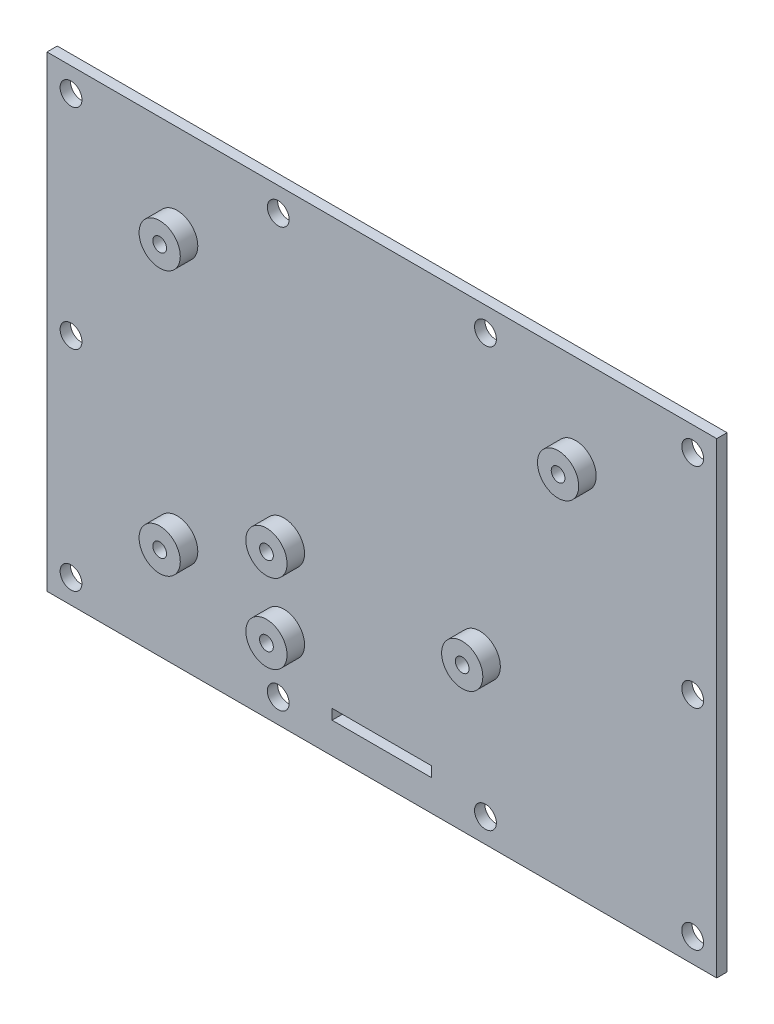
ISO-10303-21;
HEADER;
FILE_DESCRIPTION(('STEP AP214'),'2;1');
FILE_NAME('part.step','',(''),(''),'','','');
FILE_SCHEMA(('AUTOMOTIVE_DESIGN { 1 0 10303 214 1 1 1 1 }'));
ENDSEC;
DATA;
#1=APPLICATION_CONTEXT('core data for automotive mechanical design processes');
#2=APPLICATION_PROTOCOL_DEFINITION('international standard','automotive_design',2000,#1);
#3=PRODUCT_CONTEXT('',#1,'mechanical');
#4=PRODUCT('Part','Part','',(#3));
#5=PRODUCT_RELATED_PRODUCT_CATEGORY('part','',(#4));
#6=PRODUCT_DEFINITION_FORMATION('','',#4);
#7=PRODUCT_DEFINITION_CONTEXT('part definition',#1,'design');
#8=PRODUCT_DEFINITION('design','',#6,#7);
#9=PRODUCT_DEFINITION_SHAPE('','',#8);
#10=(LENGTH_UNIT() NAMED_UNIT(*) SI_UNIT(.MILLI.,.METRE.));
#11=(NAMED_UNIT(*) PLANE_ANGLE_UNIT() SI_UNIT($,.RADIAN.));
#12=(NAMED_UNIT(*) SI_UNIT($,.STERADIAN.) SOLID_ANGLE_UNIT());
#13=UNCERTAINTY_MEASURE_WITH_UNIT(LENGTH_MEASURE(1.E-05),#10,'distance_accuracy_value','');
#14=(GEOMETRIC_REPRESENTATION_CONTEXT(3) GLOBAL_UNCERTAINTY_ASSIGNED_CONTEXT((#13)) GLOBAL_UNIT_ASSIGNED_CONTEXT((#10,
#11,#12)) REPRESENTATION_CONTEXT('',''));
#15=CARTESIAN_POINT('',(0.,0.,0.));
#16=DIRECTION('',(0.,0.,1.));
#17=DIRECTION('',(1.,0.,0.));
#18=AXIS2_PLACEMENT_3D('',#15,#16,#17);
#19=CARTESIAN_POINT('',(0.,68.,-1.5));
#20=DIRECTION('',(0.,1.,0.));
#21=DIRECTION('',(0.,0.,1.));
#22=AXIS2_PLACEMENT_3D('',#19,#20,#21);
#23=PLANE('',#22);
#24=DIRECTION('',(0.,0.,1.));
#25=VECTOR('',#24,1.);
#26=CARTESIAN_POINT('',(-97.5,68.,-1.5));
#27=LINE('',#26,#25);
#28=CARTESIAN_POINT('',(-97.5,68.,-1.5));
#29=VERTEX_POINT('',#28);
#30=CARTESIAN_POINT('',(-97.5,68.,1.5));
#31=VERTEX_POINT('',#30);
#32=EDGE_CURVE('E201',#29,#31,#27,.T.);
#33=ORIENTED_EDGE('',*,*,#32,.T.);
#34=DIRECTION('',(-1.,0.,0.));
#35=VECTOR('',#34,1.);
#36=CARTESIAN_POINT('',(0.,68.,1.5));
#37=LINE('',#36,#35);
#38=CARTESIAN_POINT('',(97.4999999999999,68.,1.5));
#39=VERTEX_POINT('',#38);
#40=EDGE_CURVE('E154',#39,#31,#37,.T.);
#41=ORIENTED_EDGE('',*,*,#40,.F.);
#42=DIRECTION('',(0.,0.,1.));
#43=VECTOR('',#42,1.);
#44=CARTESIAN_POINT('',(97.4999999999999,68.,-1.5));
#45=LINE('',#44,#43);
#46=CARTESIAN_POINT('',(97.4999999999999,68.,-1.5));
#47=VERTEX_POINT('',#46);
#48=EDGE_CURVE('E61',#47,#39,#45,.T.);
#49=ORIENTED_EDGE('',*,*,#48,.F.);
#50=DIRECTION('',(-1.,0.,0.));
#51=VECTOR('',#50,1.);
#52=CARTESIAN_POINT('',(0.,68.,-1.5));
#53=LINE('',#52,#51);
#54=EDGE_CURVE('E181',#47,#29,#53,.T.);
#55=ORIENTED_EDGE('',*,*,#54,.T.);
#56=EDGE_LOOP('',(#33,#41,#49,#55));
#57=FACE_BOUND('',#56,.T.);
#58=ADVANCED_FACE('F45',(#57),#23,.T.);
#59=CARTESIAN_POINT('',(97.4999999999999,0.,-1.5));
#60=DIRECTION('',(-1.,0.,0.));
#61=DIRECTION('',(0.,0.,1.));
#62=AXIS2_PLACEMENT_3D('',#59,#60,#61);
#63=PLANE('',#62);
#64=ORIENTED_EDGE('',*,*,#48,.T.);
#65=DIRECTION('',(0.,-1.,0.));
#66=VECTOR('',#65,1.);
#67=CARTESIAN_POINT('',(97.4999999999999,0.,1.5));
#68=LINE('',#67,#66);
#69=CARTESIAN_POINT('',(97.4999999999999,-68.,1.5));
#70=VERTEX_POINT('',#69);
#71=EDGE_CURVE('E166',#39,#70,#68,.T.);
#72=ORIENTED_EDGE('',*,*,#71,.T.);
#73=DIRECTION('',(0.,0.,1.));
#74=VECTOR('',#73,1.);
#75=CARTESIAN_POINT('',(97.4999999999999,-68.,-1.5));
#76=LINE('',#75,#74);
#77=CARTESIAN_POINT('',(97.4999999999999,-68.,-1.5));
#78=VERTEX_POINT('',#77);
#79=EDGE_CURVE('E195',#78,#70,#76,.T.);
#80=ORIENTED_EDGE('',*,*,#79,.F.);
#81=DIRECTION('',(0.,-1.,0.));
#82=VECTOR('',#81,1.);
#83=CARTESIAN_POINT('',(97.4999999999999,0.,-1.5));
#84=LINE('',#83,#82);
#85=EDGE_CURVE('E125',#47,#78,#84,.T.);
#86=ORIENTED_EDGE('',*,*,#85,.F.);
#87=EDGE_LOOP('',(#64,#72,#80,#86));
#88=FACE_BOUND('',#87,.T.);
#89=ADVANCED_FACE('F259',(#88),#63,.F.);
#90=CARTESIAN_POINT('',(0.,-68.,-1.5));
#91=DIRECTION('',(0.,1.,0.));
#92=DIRECTION('',(0.,0.,1.));
#93=AXIS2_PLACEMENT_3D('',#90,#91,#92);
#94=PLANE('',#93);
#95=ORIENTED_EDGE('',*,*,#79,.T.);
#96=DIRECTION('',(-1.,0.,0.));
#97=VECTOR('',#96,1.);
#98=CARTESIAN_POINT('',(0.,-68.,1.5));
#99=LINE('',#98,#97);
#100=CARTESIAN_POINT('',(-97.5,-68.,1.5));
#101=VERTEX_POINT('',#100);
#102=EDGE_CURVE('E162',#70,#101,#99,.T.);
#103=ORIENTED_EDGE('',*,*,#102,.T.);
#104=DIRECTION('',(0.,0.,1.));
#105=VECTOR('',#104,1.);
#106=CARTESIAN_POINT('',(-97.5,-68.,-1.5));
#107=LINE('',#106,#105);
#108=CARTESIAN_POINT('',(-97.5,-68.,-1.5));
#109=VERTEX_POINT('',#108);
#110=EDGE_CURVE('E198',#109,#101,#107,.T.);
#111=ORIENTED_EDGE('',*,*,#110,.F.);
#112=DIRECTION('',(-1.,0.,0.));
#113=VECTOR('',#112,1.);
#114=CARTESIAN_POINT('',(0.,-68.,-1.5));
#115=LINE('',#114,#113);
#116=EDGE_CURVE('E69',#78,#109,#115,.T.);
#117=ORIENTED_EDGE('',*,*,#116,.F.);
#118=EDGE_LOOP('',(#95,#103,#111,#117));
#119=FACE_BOUND('',#118,.T.);
#120=ADVANCED_FACE('F264',(#119),#94,.F.);
#121=CARTESIAN_POINT('',(0.,-56.,-1.5));
#122=DIRECTION('',(0.,1.,0.));
#123=DIRECTION('',(-1.,0.,0.));
#124=AXIS2_PLACEMENT_3D('',#121,#122,#123);
#125=PLANE('',#124);
#126=DIRECTION('',(0.,0.,1.));
#127=VECTOR('',#126,1.);
#128=CARTESIAN_POINT('',(14.5,-56.,-1.5));
#129=LINE('',#128,#127);
#130=CARTESIAN_POINT('',(14.5,-56.,-1.5));
#131=VERTEX_POINT('',#130);
#132=CARTESIAN_POINT('',(14.5,-56.,1.5));
#133=VERTEX_POINT('',#132);
#134=EDGE_CURVE('E112',#131,#133,#129,.T.);
#135=ORIENTED_EDGE('',*,*,#134,.T.);
#136=DIRECTION('',(-1.,0.,0.));
#137=VECTOR('',#136,1.);
#138=CARTESIAN_POINT('',(0.,-56.,1.5));
#139=LINE('',#138,#137);
#140=CARTESIAN_POINT('',(-14.5,-56.,1.5));
#141=VERTEX_POINT('',#140);
#142=EDGE_CURVE('E116',#133,#141,#139,.T.);
#143=ORIENTED_EDGE('',*,*,#142,.T.);
#144=DIRECTION('',(0.,0.,1.));
#145=VECTOR('',#144,1.);
#146=CARTESIAN_POINT('',(-14.5,-56.,-1.5));
#147=LINE('',#146,#145);
#148=CARTESIAN_POINT('',(-14.5,-56.,-1.5));
#149=VERTEX_POINT('',#148);
#150=EDGE_CURVE('E204',#149,#141,#147,.T.);
#151=ORIENTED_EDGE('',*,*,#150,.F.);
#152=DIRECTION('',(-1.,0.,0.));
#153=VECTOR('',#152,1.);
#154=CARTESIAN_POINT('',(0.,-56.,-1.5));
#155=LINE('',#154,#153);
#156=EDGE_CURVE('E119',#131,#149,#155,.T.);
#157=ORIENTED_EDGE('',*,*,#156,.F.);
#158=EDGE_LOOP('',(#135,#143,#151,#157));
#159=FACE_BOUND('',#158,.T.);
#160=ADVANCED_FACE('F47',(#159),#125,.F.);
#161=CARTESIAN_POINT('',(-14.5,0.,-1.5));
#162=DIRECTION('',(-1.,0.,0.));
#163=DIRECTION('',(0.,0.,1.));
#164=AXIS2_PLACEMENT_3D('',#161,#162,#163);
#165=PLANE('',#164);
#166=ORIENTED_EDGE('',*,*,#150,.T.);
#167=DIRECTION('',(0.,-1.,0.));
#168=VECTOR('',#167,1.);
#169=CARTESIAN_POINT('',(-14.5,0.,1.5));
#170=LINE('',#169,#168);
#171=CARTESIAN_POINT('',(-14.5,-59.,1.5));
#172=VERTEX_POINT('',#171);
#173=EDGE_CURVE('E140',#141,#172,#170,.T.);
#174=ORIENTED_EDGE('',*,*,#173,.T.);
#175=DIRECTION('',(0.,0.,1.));
#176=VECTOR('',#175,1.);
#177=CARTESIAN_POINT('',(-14.5,-59.,-1.5));
#178=LINE('',#177,#176);
#179=CARTESIAN_POINT('',(-14.5,-59.,-1.5));
#180=VERTEX_POINT('',#179);
#181=EDGE_CURVE('E207',#180,#172,#178,.T.);
#182=ORIENTED_EDGE('',*,*,#181,.F.);
#183=DIRECTION('',(0.,-1.,0.));
#184=VECTOR('',#183,1.);
#185=CARTESIAN_POINT('',(-14.5,0.,-1.5));
#186=LINE('',#185,#184);
#187=EDGE_CURVE('E178',#149,#180,#186,.T.);
#188=ORIENTED_EDGE('',*,*,#187,.F.);
#189=EDGE_LOOP('',(#166,#174,#182,#188));
#190=FACE_BOUND('',#189,.T.);
#191=ADVANCED_FACE('F271',(#190),#165,.F.);
#192=CARTESIAN_POINT('',(0.,-59.,-1.5));
#193=DIRECTION('',(0.,-1.,0.));
#194=DIRECTION('',(0.,0.,-1.));
#195=AXIS2_PLACEMENT_3D('',#192,#193,#194);
#196=PLANE('',#195);
#197=ORIENTED_EDGE('',*,*,#181,.T.);
#198=DIRECTION('',(1.,0.,0.));
#199=VECTOR('',#198,1.);
#200=CARTESIAN_POINT('',(0.,-59.,1.5));
#201=LINE('',#200,#199);
#202=CARTESIAN_POINT('',(14.5,-59.,1.5));
#203=VERTEX_POINT('',#202);
#204=EDGE_CURVE('E135',#172,#203,#201,.T.);
#205=ORIENTED_EDGE('',*,*,#204,.T.);
#206=DIRECTION('',(0.,0.,1.));
#207=VECTOR('',#206,1.);
#208=CARTESIAN_POINT('',(14.5,-59.,-1.5));
#209=LINE('',#208,#207);
#210=CARTESIAN_POINT('',(14.5,-59.,-1.5));
#211=VERTEX_POINT('',#210);
#212=EDGE_CURVE('E124',#211,#203,#209,.T.);
#213=ORIENTED_EDGE('',*,*,#212,.F.);
#214=DIRECTION('',(1.,0.,0.));
#215=VECTOR('',#214,1.);
#216=CARTESIAN_POINT('',(0.,-59.,-1.5));
#217=LINE('',#216,#215);
#218=EDGE_CURVE('E175',#180,#211,#217,.T.);
#219=ORIENTED_EDGE('',*,*,#218,.F.);
#220=EDGE_LOOP('',(#197,#205,#213,#219));
#221=FACE_BOUND('',#220,.T.);
#222=ADVANCED_FACE('F274',(#221),#196,.F.);
#223=CARTESIAN_POINT('',(14.5,0.,-1.5));
#224=DIRECTION('',(-1.,0.,0.));
#225=DIRECTION('',(0.,0.,1.));
#226=AXIS2_PLACEMENT_3D('',#223,#224,#225);
#227=PLANE('',#226);
#228=ORIENTED_EDGE('',*,*,#212,.T.);
#229=DIRECTION('',(0.,-1.,0.));
#230=VECTOR('',#229,1.);
#231=CARTESIAN_POINT('',(14.5,0.,1.5));
#232=LINE('',#231,#230);
#233=EDGE_CURVE('E128',#133,#203,#232,.T.);
#234=ORIENTED_EDGE('',*,*,#233,.F.);
#235=ORIENTED_EDGE('',*,*,#134,.F.);
#236=DIRECTION('',(0.,-1.,0.));
#237=VECTOR('',#236,1.);
#238=CARTESIAN_POINT('',(14.5,0.,-1.5));
#239=LINE('',#238,#237);
#240=EDGE_CURVE('E172',#131,#211,#239,.T.);
#241=ORIENTED_EDGE('',*,*,#240,.T.);
#242=EDGE_LOOP('',(#228,#234,#235,#241));
#243=FACE_BOUND('',#242,.T.);
#244=ADVANCED_FACE('F129',(#243),#227,.T.);
#245=CARTESIAN_POINT('',(-97.5,0.,-1.5));
#246=DIRECTION('',(-1.,0.,0.));
#247=DIRECTION('',(0.,0.,1.));
#248=AXIS2_PLACEMENT_3D('',#245,#246,#247);
#249=PLANE('',#248);
#250=ORIENTED_EDGE('',*,*,#110,.T.);
#251=DIRECTION('',(0.,-1.,0.));
#252=VECTOR('',#251,1.);
#253=CARTESIAN_POINT('',(-97.5,0.,1.5));
#254=LINE('',#253,#252);
#255=EDGE_CURVE('E158',#31,#101,#254,.T.);
#256=ORIENTED_EDGE('',*,*,#255,.F.);
#257=ORIENTED_EDGE('',*,*,#32,.F.);
#258=DIRECTION('',(0.,-1.,0.));
#259=VECTOR('',#258,1.);
#260=CARTESIAN_POINT('',(-97.5,0.,-1.5));
#261=LINE('',#260,#259);
#262=EDGE_CURVE('E184',#29,#109,#261,.T.);
#263=ORIENTED_EDGE('',*,*,#262,.T.);
#264=EDGE_LOOP('',(#250,#256,#257,#263));
#265=FACE_BOUND('',#264,.T.);
#266=ADVANCED_FACE('F269',(#265),#249,.T.);
#267=CARTESIAN_POINT('',(0.,0.,-1.5));
#268=DIRECTION('',(0.,0.,1.));
#269=DIRECTION('',(1.,0.,0.));
#270=AXIS2_PLACEMENT_3D('',#267,#268,#269);
#271=PLANE('',#270);
#272=CARTESIAN_POINT('',(-90.5,-61.,-1.5));
#273=DIRECTION('',(0.,0.,1.));
#274=DIRECTION('',(1.,0.,0.));
#275=AXIS2_PLACEMENT_3D('',#272,#273,#274);
#276=CIRCLE('',#275,3.175);
#277=CARTESIAN_POINT('',(-87.325,-61.,-1.5));
#278=VERTEX_POINT('',#277);
#279=EDGE_CURVE('E815',#278,#278,#276,.T.);
#280=ORIENTED_EDGE('',*,*,#279,.T.);
#281=EDGE_LOOP('',(#280));
#282=FACE_BOUND('',#281,.T.);
#283=CARTESIAN_POINT('',(90.5000000000001,0.,-1.5));
#284=DIRECTION('',(0.,0.,1.));
#285=DIRECTION('',(1.,0.,0.));
#286=AXIS2_PLACEMENT_3D('',#283,#284,#285);
#287=CIRCLE('',#286,3.175);
#288=CARTESIAN_POINT('',(93.6750000000001,0.,-1.5));
#289=VERTEX_POINT('',#288);
#290=EDGE_CURVE('E798',#289,#289,#287,.T.);
#291=ORIENTED_EDGE('',*,*,#290,.T.);
#292=EDGE_LOOP('',(#291));
#293=FACE_BOUND('',#292,.T.);
#294=CARTESIAN_POINT('',(30.1666666666667,-61.,-1.5));
#295=DIRECTION('',(0.,0.,1.));
#296=DIRECTION('',(1.,0.,0.));
#297=AXIS2_PLACEMENT_3D('',#294,#295,#296);
#298=CIRCLE('',#297,3.175);
#299=CARTESIAN_POINT('',(33.3416666666667,-61.,-1.5));
#300=VERTEX_POINT('',#299);
#301=EDGE_CURVE('E799',#300,#300,#298,.T.);
#302=ORIENTED_EDGE('',*,*,#301,.T.);
#303=EDGE_LOOP('',(#302));
#304=FACE_BOUND('',#303,.T.);
#305=CARTESIAN_POINT('',(-30.1666666666667,-61.,-1.5));
#306=DIRECTION('',(0.,0.,1.));
#307=DIRECTION('',(1.,0.,0.));
#308=AXIS2_PLACEMENT_3D('',#305,#306,#307);
#309=CIRCLE('',#308,3.175);
#310=CARTESIAN_POINT('',(-26.9916666666667,-61.,-1.5));
#311=VERTEX_POINT('',#310);
#312=EDGE_CURVE('E790',#311,#311,#309,.T.);
#313=ORIENTED_EDGE('',*,*,#312,.T.);
#314=EDGE_LOOP('',(#313));
#315=FACE_BOUND('',#314,.T.);
#316=CARTESIAN_POINT('',(-90.5,0.,-1.5));
#317=DIRECTION('',(0.,0.,1.));
#318=DIRECTION('',(1.,0.,0.));
#319=AXIS2_PLACEMENT_3D('',#316,#317,#318);
#320=CIRCLE('',#319,3.175);
#321=CARTESIAN_POINT('',(-87.325,0.,-1.5));
#322=VERTEX_POINT('',#321);
#323=EDGE_CURVE('E846',#322,#322,#320,.T.);
#324=ORIENTED_EDGE('',*,*,#323,.T.);
#325=EDGE_LOOP('',(#324));
#326=FACE_BOUND('',#325,.T.);
#327=CARTESIAN_POINT('',(90.5000000000001,61.,-1.5));
#328=DIRECTION('',(0.,0.,1.));
#329=DIRECTION('',(1.,0.,0.));
#330=AXIS2_PLACEMENT_3D('',#327,#328,#329);
#331=CIRCLE('',#330,3.175);
#332=CARTESIAN_POINT('',(93.6750000000001,61.,-1.5));
#333=VERTEX_POINT('',#332);
#334=EDGE_CURVE('E830',#333,#333,#331,.T.);
#335=ORIENTED_EDGE('',*,*,#334,.T.);
#336=EDGE_LOOP('',(#335));
#337=FACE_BOUND('',#336,.T.);
#338=CARTESIAN_POINT('',(90.5000000000001,-61.,-1.5));
#339=DIRECTION('',(0.,0.,1.));
#340=DIRECTION('',(1.,0.,0.));
#341=AXIS2_PLACEMENT_3D('',#338,#339,#340);
#342=CIRCLE('',#341,3.175);
#343=CARTESIAN_POINT('',(93.6750000000001,-61.,-1.5));
#344=VERTEX_POINT('',#343);
#345=EDGE_CURVE('E831',#344,#344,#342,.T.);
#346=ORIENTED_EDGE('',*,*,#345,.T.);
#347=EDGE_LOOP('',(#346));
#348=FACE_BOUND('',#347,.T.);
#349=CARTESIAN_POINT('',(30.1666666666667,61.,-1.5));
#350=DIRECTION('',(0.,0.,1.));
#351=DIRECTION('',(1.,0.,0.));
#352=AXIS2_PLACEMENT_3D('',#349,#350,#351);
#353=CIRCLE('',#352,3.175);
#354=CARTESIAN_POINT('',(33.3416666666667,61.,-1.5));
#355=VERTEX_POINT('',#354);
#356=EDGE_CURVE('E814',#355,#355,#353,.T.);
#357=ORIENTED_EDGE('',*,*,#356,.T.);
#358=EDGE_LOOP('',(#357));
#359=FACE_BOUND('',#358,.T.);
#360=CARTESIAN_POINT('',(-30.1666666666667,61.,-1.5));
#361=DIRECTION('',(0.,0.,1.));
#362=DIRECTION('',(1.,0.,0.));
#363=AXIS2_PLACEMENT_3D('',#360,#361,#362);
#364=CIRCLE('',#363,3.175);
#365=CARTESIAN_POINT('',(-26.9916666666667,61.,-1.5));
#366=VERTEX_POINT('',#365);
#367=EDGE_CURVE('E782',#366,#366,#364,.T.);
#368=ORIENTED_EDGE('',*,*,#367,.T.);
#369=EDGE_LOOP('',(#368));
#370=FACE_BOUND('',#369,.T.);
#371=CARTESIAN_POINT('',(-90.5,61.,-1.5));
#372=DIRECTION('',(0.,0.,1.));
#373=DIRECTION('',(1.,0.,0.));
#374=AXIS2_PLACEMENT_3D('',#371,#372,#373);
#375=CIRCLE('',#374,3.175);
#376=CARTESIAN_POINT('',(-87.325,61.,-1.5));
#377=VERTEX_POINT('',#376);
#378=EDGE_CURVE('E142',#377,#377,#375,.T.);
#379=ORIENTED_EDGE('',*,*,#378,.T.);
#380=EDGE_LOOP('',(#379));
#381=FACE_BOUND('',#380,.T.);
#382=ORIENTED_EDGE('',*,*,#156,.T.);
#383=ORIENTED_EDGE('',*,*,#187,.T.);
#384=ORIENTED_EDGE('',*,*,#218,.T.);
#385=ORIENTED_EDGE('',*,*,#240,.F.);
#386=EDGE_LOOP('',(#382,#383,#384,#385));
#387=FACE_BOUND('',#386,.T.);
#388=ORIENTED_EDGE('',*,*,#54,.F.);
#389=ORIENTED_EDGE('',*,*,#85,.T.);
#390=ORIENTED_EDGE('',*,*,#116,.T.);
#391=ORIENTED_EDGE('',*,*,#262,.F.);
#392=EDGE_LOOP('',(#388,#389,#390,#391));
#393=FACE_BOUND('',#392,.T.);
#394=ADVANCED_FACE('F282',(#282,#293,#304,#315,#326,#337,#348,#359,#370,#381,#387,#393),#271,.F.);
#395=CARTESIAN_POINT('',(0.,0.,1.5));
#396=DIRECTION('',(0.,0.,1.));
#397=DIRECTION('',(1.,0.,0.));
#398=AXIS2_PLACEMENT_3D('',#395,#396,#397);
#399=PLANE('',#398);
#400=CARTESIAN_POINT('',(56.4140292633967,40.9925225406415,1.5));
#401=DIRECTION('',(0.,0.,1.));
#402=DIRECTION('',(1.,0.,0.));
#403=AXIS2_PLACEMENT_3D('',#400,#401,#402);
#404=CIRCLE('',#403,6.);
#405=CARTESIAN_POINT('',(62.4140292633967,40.9925225406415,1.5));
#406=VERTEX_POINT('',#405);
#407=EDGE_CURVE('E724',#406,#406,#404,.T.);
#408=ORIENTED_EDGE('',*,*,#407,.F.);
#409=EDGE_LOOP('',(#408));
#410=FACE_BOUND('',#409,.T.);
#411=CARTESIAN_POINT('',(-59.5859707366033,40.9925225406415,1.5));
#412=DIRECTION('',(0.,0.,1.));
#413=DIRECTION('',(1.,0.,0.));
#414=AXIS2_PLACEMENT_3D('',#411,#412,#413);
#415=CIRCLE('',#414,6.);
#416=CARTESIAN_POINT('',(-53.5859707366033,40.9925225406415,1.5));
#417=VERTEX_POINT('',#416);
#418=EDGE_CURVE('E717',#417,#417,#415,.T.);
#419=ORIENTED_EDGE('',*,*,#418,.F.);
#420=EDGE_LOOP('',(#419));
#421=FACE_BOUND('',#420,.T.);
#422=CARTESIAN_POINT('',(-59.5859707366033,-36.0074774593585,1.5));
#423=DIRECTION('',(0.,0.,1.));
#424=DIRECTION('',(1.,0.,0.));
#425=AXIS2_PLACEMENT_3D('',#422,#423,#424);
#426=CIRCLE('',#425,6.);
#427=CARTESIAN_POINT('',(-53.5859707366032,-36.0074774593585,1.5));
#428=VERTEX_POINT('',#427);
#429=EDGE_CURVE('E736',#428,#428,#426,.T.);
#430=ORIENTED_EDGE('',*,*,#429,.F.);
#431=EDGE_LOOP('',(#430));
#432=FACE_BOUND('',#431,.T.);
#433=CARTESIAN_POINT('',(28.5,-21.,1.5));
#434=DIRECTION('',(0.,0.,1.));
#435=DIRECTION('',(1.,0.,0.));
#436=AXIS2_PLACEMENT_3D('',#433,#434,#435);
#437=CIRCLE('',#436,6.);
#438=CARTESIAN_POINT('',(34.5,-21.,1.5));
#439=VERTEX_POINT('',#438);
#440=EDGE_CURVE('E753',#439,#439,#437,.T.);
#441=ORIENTED_EDGE('',*,*,#440,.F.);
#442=EDGE_LOOP('',(#441));
#443=FACE_BOUND('',#442,.T.);
#444=CARTESIAN_POINT('',(-28.5,-21.,1.5));
#445=DIRECTION('',(0.,0.,1.));
#446=DIRECTION('',(1.,0.,0.));
#447=AXIS2_PLACEMENT_3D('',#444,#445,#446);
#448=CIRCLE('',#447,6.);
#449=CARTESIAN_POINT('',(-22.5,-21.,1.5));
#450=VERTEX_POINT('',#449);
#451=EDGE_CURVE('E765',#450,#450,#448,.T.);
#452=ORIENTED_EDGE('',*,*,#451,.F.);
#453=EDGE_LOOP('',(#452));
#454=FACE_BOUND('',#453,.T.);
#455=CARTESIAN_POINT('',(-28.5,-44.,1.5));
#456=DIRECTION('',(0.,0.,1.));
#457=DIRECTION('',(1.,0.,0.));
#458=AXIS2_PLACEMENT_3D('',#455,#456,#457);
#459=CIRCLE('',#458,6.);
#460=CARTESIAN_POINT('',(-22.5,-44.,1.5));
#461=VERTEX_POINT('',#460);
#462=EDGE_CURVE('E777',#461,#461,#459,.T.);
#463=ORIENTED_EDGE('',*,*,#462,.F.);
#464=EDGE_LOOP('',(#463));
#465=FACE_BOUND('',#464,.T.);
#466=CARTESIAN_POINT('',(-90.5,-61.,1.5));
#467=DIRECTION('',(0.,0.,1.));
#468=DIRECTION('',(1.,0.,0.));
#469=AXIS2_PLACEMENT_3D('',#466,#467,#468);
#470=CIRCLE('',#469,3.175);
#471=CARTESIAN_POINT('',(-87.325,-61.,1.5));
#472=VERTEX_POINT('',#471);
#473=EDGE_CURVE('E810',#472,#472,#470,.T.);
#474=ORIENTED_EDGE('',*,*,#473,.F.);
#475=EDGE_LOOP('',(#474));
#476=FACE_BOUND('',#475,.T.);
#477=CARTESIAN_POINT('',(90.5000000000001,0.,1.5));
#478=DIRECTION('',(0.,0.,1.));
#479=DIRECTION('',(1.,0.,0.));
#480=AXIS2_PLACEMENT_3D('',#477,#478,#479);
#481=CIRCLE('',#480,3.175);
#482=CARTESIAN_POINT('',(93.6750000000001,0.,1.5));
#483=VERTEX_POINT('',#482);
#484=EDGE_CURVE('E819',#483,#483,#481,.T.);
#485=ORIENTED_EDGE('',*,*,#484,.F.);
#486=EDGE_LOOP('',(#485));
#487=FACE_BOUND('',#486,.T.);
#488=CARTESIAN_POINT('',(30.1666666666667,-61.,1.5));
#489=DIRECTION('',(0.,0.,1.));
#490=DIRECTION('',(1.,0.,0.));
#491=AXIS2_PLACEMENT_3D('',#488,#489,#490);
#492=CIRCLE('',#491,3.175);
#493=CARTESIAN_POINT('',(33.3416666666667,-61.,1.5));
#494=VERTEX_POINT('',#493);
#495=EDGE_CURVE('E794',#494,#494,#492,.T.);
#496=ORIENTED_EDGE('',*,*,#495,.F.);
#497=EDGE_LOOP('',(#496));
#498=FACE_BOUND('',#497,.T.);
#499=CARTESIAN_POINT('',(-30.1666666666667,-61.,1.5));
#500=DIRECTION('',(0.,0.,1.));
#501=DIRECTION('',(1.,0.,0.));
#502=AXIS2_PLACEMENT_3D('',#499,#500,#501);
#503=CIRCLE('',#502,3.175);
#504=CARTESIAN_POINT('',(-26.9916666666667,-61.,1.5));
#505=VERTEX_POINT('',#504);
#506=EDGE_CURVE('E803',#505,#505,#503,.T.);
#507=ORIENTED_EDGE('',*,*,#506,.F.);
#508=EDGE_LOOP('',(#507));
#509=FACE_BOUND('',#508,.T.);
#510=CARTESIAN_POINT('',(-90.5,0.,1.5));
#511=DIRECTION('',(0.,0.,1.));
#512=DIRECTION('',(1.,0.,0.));
#513=AXIS2_PLACEMENT_3D('',#510,#511,#512);
#514=CIRCLE('',#513,3.175);
#515=CARTESIAN_POINT('',(-87.325,0.,1.5));
#516=VERTEX_POINT('',#515);
#517=EDGE_CURVE('E842',#516,#516,#514,.T.);
#518=ORIENTED_EDGE('',*,*,#517,.F.);
#519=EDGE_LOOP('',(#518));
#520=FACE_BOUND('',#519,.T.);
#521=CARTESIAN_POINT('',(90.5000000000001,61.,1.5));
#522=DIRECTION('',(0.,0.,1.));
#523=DIRECTION('',(1.,0.,0.));
#524=AXIS2_PLACEMENT_3D('',#521,#522,#523);
#525=CIRCLE('',#524,3.175);
#526=CARTESIAN_POINT('',(93.6750000000001,61.,1.5));
#527=VERTEX_POINT('',#526);
#528=EDGE_CURVE('E850',#527,#527,#525,.T.);
#529=ORIENTED_EDGE('',*,*,#528,.F.);
#530=EDGE_LOOP('',(#529));
#531=FACE_BOUND('',#530,.T.);
#532=CARTESIAN_POINT('',(90.5000000000001,-61.,1.5));
#533=DIRECTION('',(0.,0.,1.));
#534=DIRECTION('',(1.,0.,0.));
#535=AXIS2_PLACEMENT_3D('',#532,#533,#534);
#536=CIRCLE('',#535,3.175);
#537=CARTESIAN_POINT('',(93.6750000000001,-61.,1.5));
#538=VERTEX_POINT('',#537);
#539=EDGE_CURVE('E826',#538,#538,#536,.T.);
#540=ORIENTED_EDGE('',*,*,#539,.F.);
#541=EDGE_LOOP('',(#540));
#542=FACE_BOUND('',#541,.T.);
#543=CARTESIAN_POINT('',(30.1666666666667,61.,1.5));
#544=DIRECTION('',(0.,0.,1.));
#545=DIRECTION('',(1.,0.,0.));
#546=AXIS2_PLACEMENT_3D('',#543,#544,#545);
#547=CIRCLE('',#546,3.175);
#548=CARTESIAN_POINT('',(33.3416666666667,61.,1.5));
#549=VERTEX_POINT('',#548);
#550=EDGE_CURVE('E835',#549,#549,#547,.T.);
#551=ORIENTED_EDGE('',*,*,#550,.F.);
#552=EDGE_LOOP('',(#551));
#553=FACE_BOUND('',#552,.T.);
#554=CARTESIAN_POINT('',(-30.1666666666667,61.,1.5));
#555=DIRECTION('',(0.,0.,1.));
#556=DIRECTION('',(1.,0.,0.));
#557=AXIS2_PLACEMENT_3D('',#554,#555,#556);
#558=CIRCLE('',#557,3.175);
#559=CARTESIAN_POINT('',(-26.9916666666667,61.,1.5));
#560=VERTEX_POINT('',#559);
#561=EDGE_CURVE('E786',#560,#560,#558,.T.);
#562=ORIENTED_EDGE('',*,*,#561,.F.);
#563=EDGE_LOOP('',(#562));
#564=FACE_BOUND('',#563,.T.);
#565=CARTESIAN_POINT('',(-90.5,61.,1.5));
#566=DIRECTION('',(0.,0.,1.));
#567=DIRECTION('',(1.,0.,0.));
#568=AXIS2_PLACEMENT_3D('',#565,#566,#567);
#569=CIRCLE('',#568,3.175);
#570=CARTESIAN_POINT('',(-87.325,61.,1.5));
#571=VERTEX_POINT('',#570);
#572=EDGE_CURVE('E146',#571,#571,#569,.T.);
#573=ORIENTED_EDGE('',*,*,#572,.F.);
#574=EDGE_LOOP('',(#573));
#575=FACE_BOUND('',#574,.T.);
#576=ORIENTED_EDGE('',*,*,#142,.F.);
#577=ORIENTED_EDGE('',*,*,#233,.T.);
#578=ORIENTED_EDGE('',*,*,#204,.F.);
#579=ORIENTED_EDGE('',*,*,#173,.F.);
#580=EDGE_LOOP('',(#576,#577,#578,#579));
#581=FACE_BOUND('',#580,.T.);
#582=ORIENTED_EDGE('',*,*,#40,.T.);
#583=ORIENTED_EDGE('',*,*,#255,.T.);
#584=ORIENTED_EDGE('',*,*,#102,.F.);
#585=ORIENTED_EDGE('',*,*,#71,.F.);
#586=EDGE_LOOP('',(#582,#583,#584,#585));
#587=FACE_BOUND('',#586,.T.);
#588=ADVANCED_FACE('F137',(#410,#421,#432,#443,#454,#465,#476,#487,#498,#509,#520,#531,#542,
#553,#564,#575,#581,#587),#399,.T.);
#589=CARTESIAN_POINT('',(-90.5,61.,-1.5));
#590=DIRECTION('',(0.,0.,1.));
#591=DIRECTION('',(1.,0.,0.));
#592=AXIS2_PLACEMENT_3D('',#589,#590,#591);
#593=CYLINDRICAL_SURFACE('',#592,3.175);
#594=ORIENTED_EDGE('',*,*,#378,.F.);
#595=EDGE_LOOP('',(#594));
#596=FACE_BOUND('',#595,.T.);
#597=ORIENTED_EDGE('',*,*,#572,.T.);
#598=EDGE_LOOP('',(#597));
#599=FACE_BOUND('',#598,.T.);
#600=ADVANCED_FACE('F335',(#596,#599),#593,.F.);
#601=CARTESIAN_POINT('',(-30.1666666666667,61.,-1.5));
#602=DIRECTION('',(0.,0.,1.));
#603=DIRECTION('',(1.,0.,0.));
#604=AXIS2_PLACEMENT_3D('',#601,#602,#603);
#605=CYLINDRICAL_SURFACE('',#604,3.175);
#606=ORIENTED_EDGE('',*,*,#367,.F.);
#607=EDGE_LOOP('',(#606));
#608=FACE_BOUND('',#607,.T.);
#609=ORIENTED_EDGE('',*,*,#561,.T.);
#610=EDGE_LOOP('',(#609));
#611=FACE_BOUND('',#610,.T.);
#612=ADVANCED_FACE('F340',(#608,#611),#605,.F.);
#613=CARTESIAN_POINT('',(30.1666666666667,61.,-1.5));
#614=DIRECTION('',(0.,0.,1.));
#615=DIRECTION('',(1.,0.,0.));
#616=AXIS2_PLACEMENT_3D('',#613,#614,#615);
#617=CYLINDRICAL_SURFACE('',#616,3.175);
#618=ORIENTED_EDGE('',*,*,#356,.F.);
#619=EDGE_LOOP('',(#618));
#620=FACE_BOUND('',#619,.T.);
#621=ORIENTED_EDGE('',*,*,#550,.T.);
#622=EDGE_LOOP('',(#621));
#623=FACE_BOUND('',#622,.T.);
#624=ADVANCED_FACE('F351',(#620,#623),#617,.F.);
#625=CARTESIAN_POINT('',(90.5000000000001,-61.,-1.5));
#626=DIRECTION('',(0.,0.,1.));
#627=DIRECTION('',(1.,0.,0.));
#628=AXIS2_PLACEMENT_3D('',#625,#626,#627);
#629=CYLINDRICAL_SURFACE('',#628,3.175);
#630=ORIENTED_EDGE('',*,*,#345,.F.);
#631=EDGE_LOOP('',(#630));
#632=FACE_BOUND('',#631,.T.);
#633=ORIENTED_EDGE('',*,*,#539,.T.);
#634=EDGE_LOOP('',(#633));
#635=FACE_BOUND('',#634,.T.);
#636=ADVANCED_FACE('F362',(#632,#635),#629,.F.);
#637=CARTESIAN_POINT('',(90.5000000000001,61.,-1.5));
#638=DIRECTION('',(0.,0.,1.));
#639=DIRECTION('',(1.,0.,0.));
#640=AXIS2_PLACEMENT_3D('',#637,#638,#639);
#641=CYLINDRICAL_SURFACE('',#640,3.175);
#642=ORIENTED_EDGE('',*,*,#334,.F.);
#643=EDGE_LOOP('',(#642));
#644=FACE_BOUND('',#643,.T.);
#645=ORIENTED_EDGE('',*,*,#528,.T.);
#646=EDGE_LOOP('',(#645));
#647=FACE_BOUND('',#646,.T.);
#648=ADVANCED_FACE('F373',(#644,#647),#641,.F.);
#649=CARTESIAN_POINT('',(-90.5,0.,-1.5));
#650=DIRECTION('',(0.,0.,1.));
#651=DIRECTION('',(1.,0.,0.));
#652=AXIS2_PLACEMENT_3D('',#649,#650,#651);
#653=CYLINDRICAL_SURFACE('',#652,3.175);
#654=ORIENTED_EDGE('',*,*,#323,.F.);
#655=EDGE_LOOP('',(#654));
#656=FACE_BOUND('',#655,.T.);
#657=ORIENTED_EDGE('',*,*,#517,.T.);
#658=EDGE_LOOP('',(#657));
#659=FACE_BOUND('',#658,.T.);
#660=ADVANCED_FACE('F384',(#656,#659),#653,.F.);
#661=CARTESIAN_POINT('',(-30.1666666666667,-61.,-1.5));
#662=DIRECTION('',(0.,0.,1.));
#663=DIRECTION('',(1.,0.,0.));
#664=AXIS2_PLACEMENT_3D('',#661,#662,#663);
#665=CYLINDRICAL_SURFACE('',#664,3.175);
#666=ORIENTED_EDGE('',*,*,#312,.F.);
#667=EDGE_LOOP('',(#666));
#668=FACE_BOUND('',#667,.T.);
#669=ORIENTED_EDGE('',*,*,#506,.T.);
#670=EDGE_LOOP('',(#669));
#671=FACE_BOUND('',#670,.T.);
#672=ADVANCED_FACE('F395',(#668,#671),#665,.F.);
#673=CARTESIAN_POINT('',(30.1666666666667,-61.,-1.5));
#674=DIRECTION('',(0.,0.,1.));
#675=DIRECTION('',(1.,0.,0.));
#676=AXIS2_PLACEMENT_3D('',#673,#674,#675);
#677=CYLINDRICAL_SURFACE('',#676,3.175);
#678=ORIENTED_EDGE('',*,*,#301,.F.);
#679=EDGE_LOOP('',(#678));
#680=FACE_BOUND('',#679,.T.);
#681=ORIENTED_EDGE('',*,*,#495,.T.);
#682=EDGE_LOOP('',(#681));
#683=FACE_BOUND('',#682,.T.);
#684=ADVANCED_FACE('F406',(#680,#683),#677,.F.);
#685=CARTESIAN_POINT('',(90.5000000000001,0.,-1.5));
#686=DIRECTION('',(0.,0.,1.));
#687=DIRECTION('',(1.,0.,0.));
#688=AXIS2_PLACEMENT_3D('',#685,#686,#687);
#689=CYLINDRICAL_SURFACE('',#688,3.175);
#690=ORIENTED_EDGE('',*,*,#290,.F.);
#691=EDGE_LOOP('',(#690));
#692=FACE_BOUND('',#691,.T.);
#693=ORIENTED_EDGE('',*,*,#484,.T.);
#694=EDGE_LOOP('',(#693));
#695=FACE_BOUND('',#694,.T.);
#696=ADVANCED_FACE('F417',(#692,#695),#689,.F.);
#697=CARTESIAN_POINT('',(-90.5,-61.,-1.5));
#698=DIRECTION('',(0.,0.,1.));
#699=DIRECTION('',(1.,0.,0.));
#700=AXIS2_PLACEMENT_3D('',#697,#698,#699);
#701=CYLINDRICAL_SURFACE('',#700,3.175);
#702=ORIENTED_EDGE('',*,*,#279,.F.);
#703=EDGE_LOOP('',(#702));
#704=FACE_BOUND('',#703,.T.);
#705=ORIENTED_EDGE('',*,*,#473,.T.);
#706=EDGE_LOOP('',(#705));
#707=FACE_BOUND('',#706,.T.);
#708=ADVANCED_FACE('F428',(#704,#707),#701,.F.);
#709=CARTESIAN_POINT('',(-28.5,-44.,6.6));
#710=DIRECTION('',(0.,0.,1.));
#711=DIRECTION('',(1.,0.,0.));
#712=AXIS2_PLACEMENT_3D('',#709,#710,#711);
#713=PLANE('',#712);
#714=CARTESIAN_POINT('',(-28.5,-44.,6.6));
#715=DIRECTION('',(0.,0.,1.));
#716=DIRECTION('',(1.,0.,0.));
#717=AXIS2_PLACEMENT_3D('',#714,#715,#716);
#718=CIRCLE('',#717,6.);
#719=CARTESIAN_POINT('',(-22.5,-44.,6.6));
#720=VERTEX_POINT('',#719);
#721=EDGE_CURVE('E778',#720,#720,#718,.T.);
#722=ORIENTED_EDGE('',*,*,#721,.T.);
#723=EDGE_LOOP('',(#722));
#724=FACE_BOUND('',#723,.T.);
#725=CARTESIAN_POINT('',(-28.5,-44.,6.6));
#726=DIRECTION('',(0.,0.,1.));
#727=DIRECTION('',(1.,0.,0.));
#728=AXIS2_PLACEMENT_3D('',#725,#726,#727);
#729=CIRCLE('',#728,2.00000000000001);
#730=CARTESIAN_POINT('',(-26.5,-44.,6.6));
#731=VERTEX_POINT('',#730);
#732=EDGE_CURVE('E770',#731,#731,#729,.T.);
#733=ORIENTED_EDGE('',*,*,#732,.F.);
#734=EDGE_LOOP('',(#733));
#735=FACE_BOUND('',#734,.T.);
#736=ADVANCED_FACE('F439',(#724,#735),#713,.T.);
#737=CARTESIAN_POINT('',(-28.5,-44.,6.6));
#738=DIRECTION('',(0.,0.,-1.));
#739=DIRECTION('',(-1.,0.,0.));
#740=AXIS2_PLACEMENT_3D('',#737,#738,#739);
#741=CYLINDRICAL_SURFACE('',#740,6.);
#742=ORIENTED_EDGE('',*,*,#721,.F.);
#743=EDGE_LOOP('',(#742));
#744=FACE_BOUND('',#743,.T.);
#745=ORIENTED_EDGE('',*,*,#462,.T.);
#746=EDGE_LOOP('',(#745));
#747=FACE_BOUND('',#746,.T.);
#748=ADVANCED_FACE('F451',(#744,#747),#741,.T.);
#749=CARTESIAN_POINT('',(-28.5,-44.,6.6));
#750=DIRECTION('',(0.,0.,-1.));
#751=DIRECTION('',(-1.,0.,0.));
#752=AXIS2_PLACEMENT_3D('',#749,#750,#751);
#753=CYLINDRICAL_SURFACE('',#752,2.00000000000001);
#754=ORIENTED_EDGE('',*,*,#732,.T.);
#755=EDGE_LOOP('',(#754));
#756=FACE_BOUND('',#755,.T.);
#757=CARTESIAN_POINT('',(-28.5,-44.,1.5));
#758=DIRECTION('',(0.,0.,1.));
#759=DIRECTION('',(1.,0.,0.));
#760=AXIS2_PLACEMENT_3D('',#757,#758,#759);
#761=CIRCLE('',#760,2.00000000000001);
#762=CARTESIAN_POINT('',(-26.5,-44.,1.5));
#763=VERTEX_POINT('',#762);
#764=EDGE_CURVE('E194',#763,#763,#761,.F.);
#765=ORIENTED_EDGE('',*,*,#764,.T.);
#766=EDGE_LOOP('',(#765));
#767=FACE_BOUND('',#766,.T.);
#768=ADVANCED_FACE('F463',(#756,#767),#753,.F.);
#769=ORIENTED_EDGE('',*,*,#764,.F.);
#770=EDGE_LOOP('',(#769));
#771=FACE_BOUND('',#770,.T.);
#772=ADVANCED_FACE('F474',(#771),#399,.T.);
#773=CARTESIAN_POINT('',(-28.5,-21.,6.6));
#774=DIRECTION('',(0.,0.,1.));
#775=DIRECTION('',(1.,0.,0.));
#776=AXIS2_PLACEMENT_3D('',#773,#774,#775);
#777=PLANE('',#776);
#778=CARTESIAN_POINT('',(-28.5,-21.,6.6));
#779=DIRECTION('',(0.,0.,1.));
#780=DIRECTION('',(1.,0.,0.));
#781=AXIS2_PLACEMENT_3D('',#778,#779,#780);
#782=CIRCLE('',#781,6.);
#783=CARTESIAN_POINT('',(-22.5,-21.,6.6));
#784=VERTEX_POINT('',#783);
#785=EDGE_CURVE('E766',#784,#784,#782,.T.);
#786=ORIENTED_EDGE('',*,*,#785,.T.);
#787=EDGE_LOOP('',(#786));
#788=FACE_BOUND('',#787,.T.);
#789=CARTESIAN_POINT('',(-28.5,-21.,6.6));
#790=DIRECTION('',(0.,0.,1.));
#791=DIRECTION('',(1.,0.,0.));
#792=AXIS2_PLACEMENT_3D('',#789,#790,#791);
#793=CIRCLE('',#792,2.00000000000001);
#794=CARTESIAN_POINT('',(-26.5,-21.,6.6));
#795=VERTEX_POINT('',#794);
#796=EDGE_CURVE('E758',#795,#795,#793,.T.);
#797=ORIENTED_EDGE('',*,*,#796,.F.);
#798=EDGE_LOOP('',(#797));
#799=FACE_BOUND('',#798,.T.);
#800=ADVANCED_FACE('F486',(#788,#799),#777,.T.);
#801=CARTESIAN_POINT('',(-28.5,-21.,6.6));
#802=DIRECTION('',(0.,0.,-1.));
#803=DIRECTION('',(-1.,0.,0.));
#804=AXIS2_PLACEMENT_3D('',#801,#802,#803);
#805=CYLINDRICAL_SURFACE('',#804,6.);
#806=ORIENTED_EDGE('',*,*,#785,.F.);
#807=EDGE_LOOP('',(#806));
#808=FACE_BOUND('',#807,.T.);
#809=ORIENTED_EDGE('',*,*,#451,.T.);
#810=EDGE_LOOP('',(#809));
#811=FACE_BOUND('',#810,.T.);
#812=ADVANCED_FACE('F495',(#808,#811),#805,.T.);
#813=CARTESIAN_POINT('',(-28.5,-21.,6.6));
#814=DIRECTION('',(0.,0.,-1.));
#815=DIRECTION('',(-1.,0.,0.));
#816=AXIS2_PLACEMENT_3D('',#813,#814,#815);
#817=CYLINDRICAL_SURFACE('',#816,2.00000000000001);
#818=ORIENTED_EDGE('',*,*,#796,.T.);
#819=EDGE_LOOP('',(#818));
#820=FACE_BOUND('',#819,.T.);
#821=CARTESIAN_POINT('',(-28.5,-21.,1.5));
#822=DIRECTION('',(0.,0.,1.));
#823=DIRECTION('',(1.,0.,0.));
#824=AXIS2_PLACEMENT_3D('',#821,#822,#823);
#825=CIRCLE('',#824,2.00000000000001);
#826=CARTESIAN_POINT('',(-26.5,-21.,1.5));
#827=VERTEX_POINT('',#826);
#828=EDGE_CURVE('E215',#827,#827,#825,.F.);
#829=ORIENTED_EDGE('',*,*,#828,.T.);
#830=EDGE_LOOP('',(#829));
#831=FACE_BOUND('',#830,.T.);
#832=ADVANCED_FACE('F507',(#820,#831),#817,.F.);
#833=ORIENTED_EDGE('',*,*,#828,.F.);
#834=EDGE_LOOP('',(#833));
#835=FACE_BOUND('',#834,.T.);
#836=ADVANCED_FACE('F488',(#835),#399,.T.);
#837=CARTESIAN_POINT('',(28.5,-21.,6.6));
#838=DIRECTION('',(0.,0.,1.));
#839=DIRECTION('',(1.,0.,0.));
#840=AXIS2_PLACEMENT_3D('',#837,#838,#839);
#841=PLANE('',#840);
#842=CARTESIAN_POINT('',(28.5,-21.,6.6));
#843=DIRECTION('',(0.,0.,1.));
#844=DIRECTION('',(1.,0.,0.));
#845=AXIS2_PLACEMENT_3D('',#842,#843,#844);
#846=CIRCLE('',#845,6.);
#847=CARTESIAN_POINT('',(34.5,-21.,6.6));
#848=VERTEX_POINT('',#847);
#849=EDGE_CURVE('E754',#848,#848,#846,.T.);
#850=ORIENTED_EDGE('',*,*,#849,.T.);
#851=EDGE_LOOP('',(#850));
#852=FACE_BOUND('',#851,.T.);
#853=CARTESIAN_POINT('',(28.5,-21.,6.6));
#854=DIRECTION('',(0.,0.,1.));
#855=DIRECTION('',(1.,0.,0.));
#856=AXIS2_PLACEMENT_3D('',#853,#854,#855);
#857=CIRCLE('',#856,2.00000000000001);
#858=CARTESIAN_POINT('',(30.5,-21.,6.6));
#859=VERTEX_POINT('',#858);
#860=EDGE_CURVE('E746',#859,#859,#857,.T.);
#861=ORIENTED_EDGE('',*,*,#860,.F.);
#862=EDGE_LOOP('',(#861));
#863=FACE_BOUND('',#862,.T.);
#864=ADVANCED_FACE('F529',(#852,#863),#841,.T.);
#865=CARTESIAN_POINT('',(28.5,-21.,6.6));
#866=DIRECTION('',(0.,0.,-1.));
#867=DIRECTION('',(-1.,0.,0.));
#868=AXIS2_PLACEMENT_3D('',#865,#866,#867);
#869=CYLINDRICAL_SURFACE('',#868,6.);
#870=ORIENTED_EDGE('',*,*,#849,.F.);
#871=EDGE_LOOP('',(#870));
#872=FACE_BOUND('',#871,.T.);
#873=ORIENTED_EDGE('',*,*,#440,.T.);
#874=EDGE_LOOP('',(#873));
#875=FACE_BOUND('',#874,.T.);
#876=ADVANCED_FACE('F538',(#872,#875),#869,.T.);
#877=CARTESIAN_POINT('',(28.5,-21.,6.6));
#878=DIRECTION('',(0.,0.,-1.));
#879=DIRECTION('',(-1.,0.,0.));
#880=AXIS2_PLACEMENT_3D('',#877,#878,#879);
#881=CYLINDRICAL_SURFACE('',#880,2.00000000000001);
#882=ORIENTED_EDGE('',*,*,#860,.T.);
#883=EDGE_LOOP('',(#882));
#884=FACE_BOUND('',#883,.T.);
#885=CARTESIAN_POINT('',(28.5,-21.,1.5));
#886=DIRECTION('',(0.,0.,1.));
#887=DIRECTION('',(1.,0.,0.));
#888=AXIS2_PLACEMENT_3D('',#885,#886,#887);
#889=CIRCLE('',#888,2.00000000000001);
#890=CARTESIAN_POINT('',(30.5,-21.,1.5));
#891=VERTEX_POINT('',#890);
#892=EDGE_CURVE('E219',#891,#891,#889,.F.);
#893=ORIENTED_EDGE('',*,*,#892,.T.);
#894=EDGE_LOOP('',(#893));
#895=FACE_BOUND('',#894,.T.);
#896=ADVANCED_FACE('F549',(#884,#895),#881,.F.);
#897=ORIENTED_EDGE('',*,*,#892,.F.);
#898=EDGE_LOOP('',(#897));
#899=FACE_BOUND('',#898,.T.);
#900=ADVANCED_FACE('F254',(#899),#399,.T.);
#901=CARTESIAN_POINT('',(-59.5859707366033,-36.0074774593585,6.6));
#902=DIRECTION('',(0.,0.,-1.));
#903=DIRECTION('',(-1.,0.,0.));
#904=AXIS2_PLACEMENT_3D('',#901,#902,#903);
#905=CYLINDRICAL_SURFACE('',#904,2.00000000000001);
#906=CARTESIAN_POINT('',(-59.5859707366033,-36.0074774593585,6.6));
#907=DIRECTION('',(0.,0.,1.));
#908=DIRECTION('',(1.,0.,0.));
#909=AXIS2_PLACEMENT_3D('',#906,#907,#908);
#910=CIRCLE('',#909,2.00000000000001);
#911=CARTESIAN_POINT('',(-57.5859707366032,-36.0074774593585,6.6));
#912=VERTEX_POINT('',#911);
#913=EDGE_CURVE('E738',#912,#912,#910,.T.);
#914=ORIENTED_EDGE('',*,*,#913,.T.);
#915=EDGE_LOOP('',(#914));
#916=FACE_BOUND('',#915,.T.);
#917=CARTESIAN_POINT('',(-59.5859707366033,-36.0074774593585,1.5));
#918=DIRECTION('',(0.,0.,1.));
#919=DIRECTION('',(1.,0.,0.));
#920=AXIS2_PLACEMENT_3D('',#917,#918,#919);
#921=CIRCLE('',#920,2.00000000000001);
#922=CARTESIAN_POINT('',(-57.5859707366032,-36.0074774593585,1.5));
#923=VERTEX_POINT('',#922);
#924=EDGE_CURVE('E223',#923,#923,#921,.F.);
#925=ORIENTED_EDGE('',*,*,#924,.T.);
#926=EDGE_LOOP('',(#925));
#927=FACE_BOUND('',#926,.T.);
#928=ADVANCED_FACE('F570',(#916,#927),#905,.F.);
#929=CARTESIAN_POINT('',(-59.5859707366033,-36.0074774593585,6.6));
#930=DIRECTION('',(0.,0.,-1.));
#931=DIRECTION('',(-1.,0.,0.));
#932=AXIS2_PLACEMENT_3D('',#929,#930,#931);
#933=CYLINDRICAL_SURFACE('',#932,6.);
#934=CARTESIAN_POINT('',(-59.5859707366033,-36.0074774593585,6.6));
#935=DIRECTION('',(0.,0.,1.));
#936=DIRECTION('',(1.,0.,0.));
#937=AXIS2_PLACEMENT_3D('',#934,#935,#936);
#938=CIRCLE('',#937,6.);
#939=CARTESIAN_POINT('',(-53.5859707366032,-36.0074774593585,6.6));
#940=VERTEX_POINT('',#939);
#941=EDGE_CURVE('E742',#940,#940,#938,.T.);
#942=ORIENTED_EDGE('',*,*,#941,.F.);
#943=EDGE_LOOP('',(#942));
#944=FACE_BOUND('',#943,.T.);
#945=ORIENTED_EDGE('',*,*,#429,.T.);
#946=EDGE_LOOP('',(#945));
#947=FACE_BOUND('',#946,.T.);
#948=ADVANCED_FACE('F578',(#944,#947),#933,.T.);
#949=CARTESIAN_POINT('',(0.,0.,6.6));
#950=DIRECTION('',(0.,0.,1.));
#951=DIRECTION('',(1.,0.,0.));
#952=AXIS2_PLACEMENT_3D('',#949,#950,#951);
#953=PLANE('',#952);
#954=ORIENTED_EDGE('',*,*,#913,.F.);
#955=EDGE_LOOP('',(#954));
#956=FACE_BOUND('',#955,.T.);
#957=ORIENTED_EDGE('',*,*,#941,.T.);
#958=EDGE_LOOP('',(#957));
#959=FACE_BOUND('',#958,.T.);
#960=ADVANCED_FACE('F252',(#956,#959),#953,.T.);
#961=ORIENTED_EDGE('',*,*,#924,.F.);
#962=EDGE_LOOP('',(#961));
#963=FACE_BOUND('',#962,.T.);
#964=ADVANCED_FACE('F237',(#963),#399,.T.);
#965=CARTESIAN_POINT('',(-59.5859707366033,40.9925225406415,6.6));
#966=DIRECTION('',(0.,0.,-1.));
#967=DIRECTION('',(-1.,0.,0.));
#968=AXIS2_PLACEMENT_3D('',#965,#966,#967);
#969=CYLINDRICAL_SURFACE('',#968,2.00000000000001);
#970=CARTESIAN_POINT('',(-59.5859707366033,40.9925225406415,6.6));
#971=DIRECTION('',(0.,0.,1.));
#972=DIRECTION('',(1.,0.,0.));
#973=AXIS2_PLACEMENT_3D('',#970,#971,#972);
#974=CIRCLE('',#973,2.00000000000001);
#975=CARTESIAN_POINT('',(-57.5859707366033,40.9925225406415,6.6));
#976=VERTEX_POINT('',#975);
#977=EDGE_CURVE('E722',#976,#976,#974,.T.);
#978=ORIENTED_EDGE('',*,*,#977,.T.);
#979=EDGE_LOOP('',(#978));
#980=FACE_BOUND('',#979,.T.);
#981=CARTESIAN_POINT('',(-59.5859707366033,40.9925225406415,1.5));
#982=DIRECTION('',(0.,0.,1.));
#983=DIRECTION('',(1.,0.,0.));
#984=AXIS2_PLACEMENT_3D('',#981,#982,#983);
#985=CIRCLE('',#984,2.00000000000001);
#986=CARTESIAN_POINT('',(-57.5859707366033,40.9925225406415,1.5));
#987=VERTEX_POINT('',#986);
#988=EDGE_CURVE('E54',#987,#987,#985,.F.);
#989=ORIENTED_EDGE('',*,*,#988,.T.);
#990=EDGE_LOOP('',(#989));
#991=FACE_BOUND('',#990,.T.);
#992=ADVANCED_FACE('F230',(#980,#991),#969,.F.);
#993=CARTESIAN_POINT('',(-59.5859707366033,40.9925225406415,6.6));
#994=DIRECTION('',(0.,0.,-1.));
#995=DIRECTION('',(-1.,0.,0.));
#996=AXIS2_PLACEMENT_3D('',#993,#994,#995);
#997=CYLINDRICAL_SURFACE('',#996,6.);
#998=CARTESIAN_POINT('',(-59.5859707366033,40.9925225406415,6.6));
#999=DIRECTION('',(0.,0.,1.));
#1000=DIRECTION('',(1.,0.,0.));
#1001=AXIS2_PLACEMENT_3D('',#998,#999,#1000);
#1002=CIRCLE('',#1001,6.);
#1003=CARTESIAN_POINT('',(-53.5859707366033,40.9925225406415,6.6));
#1004=VERTEX_POINT('',#1003);
#1005=EDGE_CURVE('E733',#1004,#1004,#1002,.T.);
#1006=ORIENTED_EDGE('',*,*,#1005,.F.);
#1007=EDGE_LOOP('',(#1006));
#1008=FACE_BOUND('',#1007,.T.);
#1009=ORIENTED_EDGE('',*,*,#418,.T.);
#1010=EDGE_LOOP('',(#1009));
#1011=FACE_BOUND('',#1010,.T.);
#1012=ADVANCED_FACE('F246',(#1008,#1011),#997,.T.);
#1013=CARTESIAN_POINT('',(0.,77.,6.6));
#1014=DIRECTION('',(0.,0.,1.));
#1015=DIRECTION('',(1.,0.,0.));
#1016=AXIS2_PLACEMENT_3D('',#1013,#1014,#1015);
#1017=PLANE('',#1016);
#1018=ORIENTED_EDGE('',*,*,#977,.F.);
#1019=EDGE_LOOP('',(#1018));
#1020=FACE_BOUND('',#1019,.T.);
#1021=ORIENTED_EDGE('',*,*,#1005,.T.);
#1022=EDGE_LOOP('',(#1021));
#1023=FACE_BOUND('',#1022,.T.);
#1024=ADVANCED_FACE('F235',(#1020,#1023),#1017,.T.);
#1025=ORIENTED_EDGE('',*,*,#988,.F.);
#1026=EDGE_LOOP('',(#1025));
#1027=FACE_BOUND('',#1026,.T.);
#1028=ADVANCED_FACE('F232',(#1027),#399,.T.);
#1029=CARTESIAN_POINT('',(56.4140292633967,40.9925225406415,6.6));
#1030=DIRECTION('',(0.,0.,-1.));
#1031=DIRECTION('',(-1.,0.,0.));
#1032=AXIS2_PLACEMENT_3D('',#1029,#1030,#1031);
#1033=CYLINDRICAL_SURFACE('',#1032,2.00000000000001);
#1034=CARTESIAN_POINT('',(56.4140292633967,40.9925225406415,6.6));
#1035=DIRECTION('',(0.,0.,1.));
#1036=DIRECTION('',(1.,0.,0.));
#1037=AXIS2_PLACEMENT_3D('',#1034,#1035,#1036);
#1038=CIRCLE('',#1037,2.00000000000001);
#1039=CARTESIAN_POINT('',(58.4140292633967,40.9925225406415,6.6));
#1040=VERTEX_POINT('',#1039);
#1041=EDGE_CURVE('E712',#1040,#1040,#1038,.T.);
#1042=ORIENTED_EDGE('',*,*,#1041,.T.);
#1043=EDGE_LOOP('',(#1042));
#1044=FACE_BOUND('',#1043,.T.);
#1045=CARTESIAN_POINT('',(56.4140292633967,40.9925225406415,1.5));
#1046=DIRECTION('',(0.,0.,1.));
#1047=DIRECTION('',(1.,0.,0.));
#1048=AXIS2_PLACEMENT_3D('',#1045,#1046,#1047);
#1049=CIRCLE('',#1048,2.00000000000001);
#1050=CARTESIAN_POINT('',(58.4140292633967,40.9925225406415,1.5));
#1051=VERTEX_POINT('',#1050);
#1052=EDGE_CURVE('E11',#1051,#1051,#1049,.F.);
#1053=ORIENTED_EDGE('',*,*,#1052,.T.);
#1054=EDGE_LOOP('',(#1053));
#1055=FACE_BOUND('',#1054,.T.);
#1056=ADVANCED_FACE('F234',(#1044,#1055),#1033,.F.);
#1057=CARTESIAN_POINT('',(56.4140292633967,40.9925225406415,6.6));
#1058=DIRECTION('',(0.,0.,-1.));
#1059=DIRECTION('',(-1.,0.,0.));
#1060=AXIS2_PLACEMENT_3D('',#1057,#1058,#1059);
#1061=CYLINDRICAL_SURFACE('',#1060,6.);
#1062=CARTESIAN_POINT('',(56.4140292633967,40.9925225406415,6.6));
#1063=DIRECTION('',(0.,0.,1.));
#1064=DIRECTION('',(1.,0.,0.));
#1065=AXIS2_PLACEMENT_3D('',#1062,#1063,#1064);
#1066=CIRCLE('',#1065,6.);
#1067=CARTESIAN_POINT('',(62.4140292633967,40.9925225406415,6.6));
#1068=VERTEX_POINT('',#1067);
#1069=EDGE_CURVE('E715',#1068,#1068,#1066,.T.);
#1070=ORIENTED_EDGE('',*,*,#1069,.F.);
#1071=EDGE_LOOP('',(#1070));
#1072=FACE_BOUND('',#1071,.T.);
#1073=ORIENTED_EDGE('',*,*,#407,.T.);
#1074=EDGE_LOOP('',(#1073));
#1075=FACE_BOUND('',#1074,.T.);
#1076=ADVANCED_FACE('F243',(#1072,#1075),#1061,.T.);
#1077=CARTESIAN_POINT('',(116.,77.,6.6));
#1078=DIRECTION('',(0.,0.,1.));
#1079=DIRECTION('',(1.,0.,0.));
#1080=AXIS2_PLACEMENT_3D('',#1077,#1078,#1079);
#1081=PLANE('',#1080);
#1082=ORIENTED_EDGE('',*,*,#1041,.F.);
#1083=EDGE_LOOP('',(#1082));
#1084=FACE_BOUND('',#1083,.T.);
#1085=ORIENTED_EDGE('',*,*,#1069,.T.);
#1086=EDGE_LOOP('',(#1085));
#1087=FACE_BOUND('',#1086,.T.);
#1088=ADVANCED_FACE('F256',(#1084,#1087),#1081,.T.);
#1089=ORIENTED_EDGE('',*,*,#1052,.F.);
#1090=EDGE_LOOP('',(#1089));
#1091=FACE_BOUND('',#1090,.T.);
#1092=ADVANCED_FACE('F238',(#1091),#399,.T.);
#1093=CLOSED_SHELL('',(#58,#89,#120,#160,#191,#222,#244,#266,#394,#588,#600,#612,#624,#636,#648,
#660,#672,#684,#696,#708,#736,#748,#768,#772,#800,#812,#832,#836,#864,#876,#896,#900,#928,#948,
#960,#964,#992,#1012,#1024,#1028,#1056,#1076,#1088,#1092));
#1094=MANIFOLD_SOLID_BREP('B2',#1093);
#1095=ADVANCED_BREP_SHAPE_REPRESENTATION('',(#18,#1094),#14);
#1096=SHAPE_DEFINITION_REPRESENTATION(#9,#1095);
ENDSEC;
END-ISO-10303-21;
